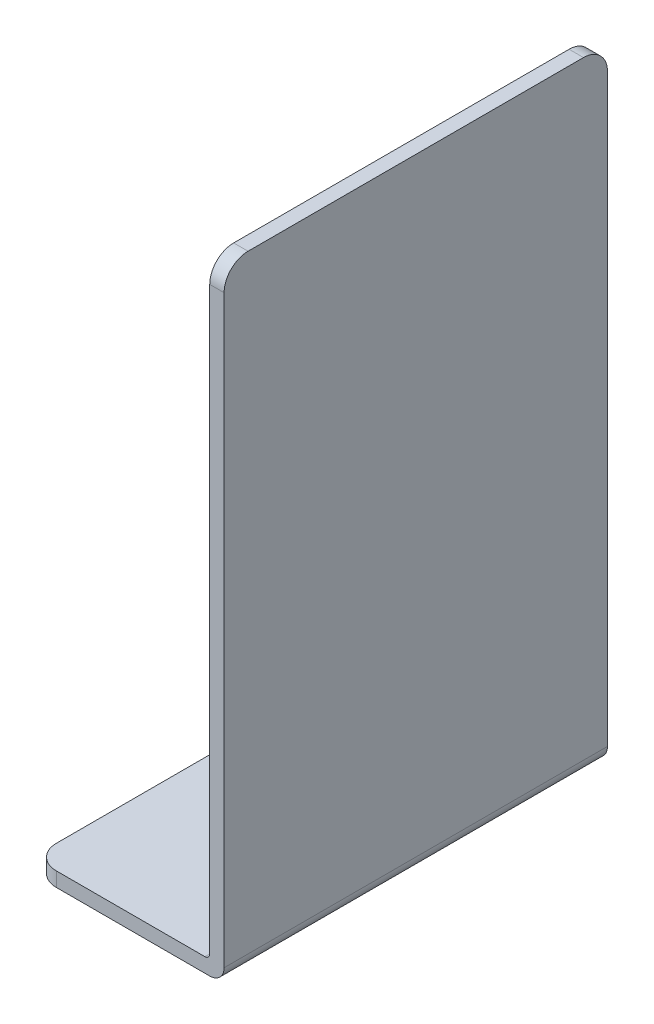
ISO-10303-21;
HEADER;
FILE_DESCRIPTION(('STEP AP214'),'2;1');
FILE_NAME('part.step','',(''),(''),'','','');
FILE_SCHEMA(('AUTOMOTIVE_DESIGN { 1 0 10303 214 1 1 1 1 }'));
ENDSEC;
DATA;
#1=APPLICATION_CONTEXT('core data for automotive mechanical design processes');
#2=APPLICATION_PROTOCOL_DEFINITION('international standard','automotive_design',2000,#1);
#3=PRODUCT_CONTEXT('',#1,'mechanical');
#4=PRODUCT('Part','Part','',(#3));
#5=PRODUCT_RELATED_PRODUCT_CATEGORY('part','',(#4));
#6=PRODUCT_DEFINITION_FORMATION('','',#4);
#7=PRODUCT_DEFINITION_CONTEXT('part definition',#1,'design');
#8=PRODUCT_DEFINITION('design','',#6,#7);
#9=PRODUCT_DEFINITION_SHAPE('','',#8);
#10=(LENGTH_UNIT() NAMED_UNIT(*) SI_UNIT(.MILLI.,.METRE.));
#11=(NAMED_UNIT(*) PLANE_ANGLE_UNIT() SI_UNIT($,.RADIAN.));
#12=(NAMED_UNIT(*) SI_UNIT($,.STERADIAN.) SOLID_ANGLE_UNIT());
#13=UNCERTAINTY_MEASURE_WITH_UNIT(LENGTH_MEASURE(1.E-05),#10,'distance_accuracy_value','');
#14=(GEOMETRIC_REPRESENTATION_CONTEXT(3) GLOBAL_UNCERTAINTY_ASSIGNED_CONTEXT((#13)) GLOBAL_UNIT_ASSIGNED_CONTEXT((#10,
#11,#12)) REPRESENTATION_CONTEXT('',''));
#15=CARTESIAN_POINT('',(0.,0.,0.));
#16=DIRECTION('',(0.,0.,1.));
#17=DIRECTION('',(1.,0.,0.));
#18=AXIS2_PLACEMENT_3D('',#15,#16,#17);
#19=CARTESIAN_POINT('',(-6.,0.,160.));
#20=DIRECTION('',(0.,-1.,0.));
#21=DIRECTION('',(0.,0.,-1.));
#22=AXIS2_PLACEMENT_3D('',#19,#20,#21);
#23=PLANE('',#22);
#24=DIRECTION('',(0.,0.,-1.));
#25=VECTOR('',#24,1.);
#26=CARTESIAN_POINT('',(0.,0.,160.));
#27=LINE('',#26,#25);
#28=CARTESIAN_POINT('',(0.,0.,150.));
#29=VERTEX_POINT('',#28);
#30=CARTESIAN_POINT('',(0.,0.,10.));
#31=VERTEX_POINT('',#30);
#32=EDGE_CURVE('E179',#29,#31,#27,.T.);
#33=ORIENTED_EDGE('',*,*,#32,.T.);
#34=DIRECTION('',(-1.,0.,0.));
#35=VECTOR('',#34,1.);
#36=CARTESIAN_POINT('',(-6.,0.,10.));
#37=LINE('',#36,#35);
#38=CARTESIAN_POINT('',(-6.,0.,10.));
#39=VERTEX_POINT('',#38);
#40=EDGE_CURVE('E252',#31,#39,#37,.T.);
#41=ORIENTED_EDGE('',*,*,#40,.T.);
#42=DIRECTION('',(0.,0.,-1.));
#43=VECTOR('',#42,1.);
#44=CARTESIAN_POINT('',(-6.,0.,160.));
#45=LINE('',#44,#43);
#46=CARTESIAN_POINT('',(-6.,0.,150.));
#47=VERTEX_POINT('',#46);
#48=EDGE_CURVE('E158',#47,#39,#45,.T.);
#49=ORIENTED_EDGE('',*,*,#48,.F.);
#50=DIRECTION('',(-1.,0.,0.));
#51=VECTOR('',#50,1.);
#52=CARTESIAN_POINT('',(-6.,0.,150.));
#53=LINE('',#52,#51);
#54=EDGE_CURVE('E66',#47,#29,#53,.F.);
#55=ORIENTED_EDGE('',*,*,#54,.T.);
#56=EDGE_LOOP('',(#33,#41,#49,#55));
#57=FACE_BOUND('',#56,.T.);
#58=ADVANCED_FACE('F45',(#57),#23,.F.);
#59=CARTESIAN_POINT('',(-5.99999999999997,-252.,160.));
#60=DIRECTION('',(1.,0.,0.));
#61=DIRECTION('',(0.,1.,0.));
#62=AXIS2_PLACEMENT_3D('',#59,#60,#61);
#63=PLANE('',#62);
#64=ORIENTED_EDGE('',*,*,#48,.T.);
#65=CARTESIAN_POINT('',(-6.,-10.,10.));
#66=DIRECTION('',(1.,0.,0.));
#67=DIRECTION('',(0.,1.,0.));
#68=AXIS2_PLACEMENT_3D('',#65,#66,#67);
#69=CIRCLE('',#68,10.);
#70=CARTESIAN_POINT('',(-6.,-10.,0.));
#71=VERTEX_POINT('',#70);
#72=EDGE_CURVE('E259',#39,#71,#69,.F.);
#73=ORIENTED_EDGE('',*,*,#72,.T.);
#74=DIRECTION('',(0.,-1.,0.));
#75=VECTOR('',#74,1.);
#76=CARTESIAN_POINT('',(-5.99999999999997,-252.,0.));
#77=LINE('',#76,#75);
#78=CARTESIAN_POINT('',(-5.99999999999998,-252.,0.));
#79=VERTEX_POINT('',#78);
#80=EDGE_CURVE('E154',#71,#79,#77,.T.);
#81=ORIENTED_EDGE('',*,*,#80,.T.);
#82=DIRECTION('',(0.,0.,-1.));
#83=VECTOR('',#82,1.);
#84=CARTESIAN_POINT('',(-5.99999999999998,-252.,160.));
#85=LINE('',#84,#83);
#86=CARTESIAN_POINT('',(-5.99999999999998,-252.,160.));
#87=VERTEX_POINT('',#86);
#88=EDGE_CURVE('E150',#87,#79,#85,.T.);
#89=ORIENTED_EDGE('',*,*,#88,.F.);
#90=DIRECTION('',(0.,-1.,0.));
#91=VECTOR('',#90,1.);
#92=CARTESIAN_POINT('',(-5.99999999999997,-252.,160.));
#93=LINE('',#92,#91);
#94=CARTESIAN_POINT('',(-6.,-10.,160.));
#95=VERTEX_POINT('',#94);
#96=EDGE_CURVE('E135',#95,#87,#93,.T.);
#97=ORIENTED_EDGE('',*,*,#96,.F.);
#98=CARTESIAN_POINT('',(-6.,-10.,150.));
#99=DIRECTION('',(1.,0.,0.));
#100=DIRECTION('',(0.,1.,0.));
#101=AXIS2_PLACEMENT_3D('',#98,#99,#100);
#102=CIRCLE('',#101,10.);
#103=EDGE_CURVE('E256',#95,#47,#102,.F.);
#104=ORIENTED_EDGE('',*,*,#103,.T.);
#105=EDGE_LOOP('',(#64,#73,#81,#89,#97,#104));
#106=FACE_BOUND('',#105,.T.);
#107=ADVANCED_FACE('F152',(#106),#63,.F.);
#108=CARTESIAN_POINT('',(-7.99999999999998,-252.,160.));
#109=DIRECTION('',(0.,0.,-1.));
#110=DIRECTION('',(-1.,0.,0.));
#111=AXIS2_PLACEMENT_3D('',#108,#109,#110);
#112=CYLINDRICAL_SURFACE('',#111,2.);
#113=CARTESIAN_POINT('',(-7.99999999999998,-252.,0.));
#114=DIRECTION('',(0.,0.,-1.));
#115=DIRECTION('',(1.,0.,0.));
#116=AXIS2_PLACEMENT_3D('',#113,#114,#115);
#117=CIRCLE('',#116,2.);
#118=CARTESIAN_POINT('',(-7.99999999999998,-254.,0.));
#119=VERTEX_POINT('',#118);
#120=EDGE_CURVE('E182',#79,#119,#117,.T.);
#121=ORIENTED_EDGE('',*,*,#120,.T.);
#122=DIRECTION('',(0.,0.,-1.));
#123=VECTOR('',#122,1.);
#124=CARTESIAN_POINT('',(-7.99999999999998,-254.,160.));
#125=LINE('',#124,#123);
#126=CARTESIAN_POINT('',(-7.99999999999998,-254.,160.));
#127=VERTEX_POINT('',#126);
#128=EDGE_CURVE('E159',#127,#119,#125,.T.);
#129=ORIENTED_EDGE('',*,*,#128,.F.);
#130=CARTESIAN_POINT('',(-7.99999999999998,-252.,160.));
#131=DIRECTION('',(0.,0.,-1.));
#132=DIRECTION('',(1.,0.,0.));
#133=AXIS2_PLACEMENT_3D('',#130,#131,#132);
#134=CIRCLE('',#133,2.);
#135=EDGE_CURVE('E140',#87,#127,#134,.T.);
#136=ORIENTED_EDGE('',*,*,#135,.F.);
#137=ORIENTED_EDGE('',*,*,#88,.T.);
#138=EDGE_LOOP('',(#121,#129,#136,#137));
#139=FACE_BOUND('',#138,.T.);
#140=ADVANCED_FACE('F161',(#139),#112,.F.);
#141=CARTESIAN_POINT('',(-80.,-254.,160.));
#142=DIRECTION('',(0.,-1.,0.));
#143=DIRECTION('',(0.,0.,-1.));
#144=AXIS2_PLACEMENT_3D('',#141,#142,#143);
#145=PLANE('',#144);
#146=DIRECTION('',(0.,0.,-1.));
#147=VECTOR('',#146,1.);
#148=CARTESIAN_POINT('',(-80.,-254.,160.));
#149=LINE('',#148,#147);
#150=CARTESIAN_POINT('',(-80.,-254.,150.));
#151=VERTEX_POINT('',#150);
#152=CARTESIAN_POINT('',(-80.,-254.,10.));
#153=VERTEX_POINT('',#152);
#154=EDGE_CURVE('E211',#151,#153,#149,.T.);
#155=ORIENTED_EDGE('',*,*,#154,.F.);
#156=CARTESIAN_POINT('',(-70.,-254.,150.));
#157=DIRECTION('',(0.,-1.,0.));
#158=DIRECTION('',(0.,0.,-1.));
#159=AXIS2_PLACEMENT_3D('',#156,#157,#158);
#160=CIRCLE('',#159,10.);
#161=CARTESIAN_POINT('',(-70.,-254.,160.));
#162=VERTEX_POINT('',#161);
#163=EDGE_CURVE('E241',#151,#162,#160,.F.);
#164=ORIENTED_EDGE('',*,*,#163,.T.);
#165=DIRECTION('',(-1.,0.,0.));
#166=VECTOR('',#165,1.);
#167=CARTESIAN_POINT('',(-80.,-254.,160.));
#168=LINE('',#167,#166);
#169=EDGE_CURVE('E165',#127,#162,#168,.T.);
#170=ORIENTED_EDGE('',*,*,#169,.F.);
#171=ORIENTED_EDGE('',*,*,#128,.T.);
#172=DIRECTION('',(-1.,0.,0.));
#173=VECTOR('',#172,1.);
#174=CARTESIAN_POINT('',(-80.,-254.,0.));
#175=LINE('',#174,#173);
#176=CARTESIAN_POINT('',(-70.,-254.,0.));
#177=VERTEX_POINT('',#176);
#178=EDGE_CURVE('E185',#119,#177,#175,.T.);
#179=ORIENTED_EDGE('',*,*,#178,.T.);
#180=CARTESIAN_POINT('',(-70.,-254.,10.));
#181=DIRECTION('',(0.,-1.,0.));
#182=DIRECTION('',(0.,0.,-1.));
#183=AXIS2_PLACEMENT_3D('',#180,#181,#182);
#184=CIRCLE('',#183,10.);
#185=EDGE_CURVE('E238',#177,#153,#184,.F.);
#186=ORIENTED_EDGE('',*,*,#185,.T.);
#187=EDGE_LOOP('',(#155,#164,#170,#171,#179,#186));
#188=FACE_BOUND('',#187,.T.);
#189=ADVANCED_FACE('F279',(#188),#145,.F.);
#190=CARTESIAN_POINT('',(-80.,-260.,160.));
#191=DIRECTION('',(1.,0.,0.));
#192=DIRECTION('',(0.,1.,0.));
#193=AXIS2_PLACEMENT_3D('',#190,#191,#192);
#194=PLANE('',#193);
#195=DIRECTION('',(0.,0.,-1.));
#196=VECTOR('',#195,1.);
#197=CARTESIAN_POINT('',(-80.,-260.,160.));
#198=LINE('',#197,#196);
#199=CARTESIAN_POINT('',(-80.,-260.,150.));
#200=VERTEX_POINT('',#199);
#201=CARTESIAN_POINT('',(-80.,-260.,10.));
#202=VERTEX_POINT('',#201);
#203=EDGE_CURVE('E207',#200,#202,#198,.T.);
#204=ORIENTED_EDGE('',*,*,#203,.F.);
#205=DIRECTION('',(0.,-1.,0.));
#206=VECTOR('',#205,1.);
#207=CARTESIAN_POINT('',(-80.,-260.,150.));
#208=LINE('',#207,#206);
#209=EDGE_CURVE('E235',#200,#151,#208,.F.);
#210=ORIENTED_EDGE('',*,*,#209,.T.);
#211=ORIENTED_EDGE('',*,*,#154,.T.);
#212=DIRECTION('',(0.,-1.,0.));
#213=VECTOR('',#212,1.);
#214=CARTESIAN_POINT('',(-80.,-260.,10.));
#215=LINE('',#214,#213);
#216=EDGE_CURVE('E231',#153,#202,#215,.T.);
#217=ORIENTED_EDGE('',*,*,#216,.T.);
#218=EDGE_LOOP('',(#204,#210,#211,#217));
#219=FACE_BOUND('',#218,.T.);
#220=ADVANCED_FACE('F292',(#219),#194,.F.);
#221=CARTESIAN_POINT('',(-5.99999999999997,-260.,160.));
#222=DIRECTION('',(0.,1.,0.));
#223=DIRECTION('',(0.,0.,1.));
#224=AXIS2_PLACEMENT_3D('',#221,#222,#223);
#225=PLANE('',#224);
#226=DIRECTION('',(1.,0.,0.));
#227=VECTOR('',#226,1.);
#228=CARTESIAN_POINT('',(-5.99999999999997,-260.,160.));
#229=LINE('',#228,#227);
#230=CARTESIAN_POINT('',(-70.,-260.,160.));
#231=VERTEX_POINT('',#230);
#232=CARTESIAN_POINT('',(-5.99999999999997,-260.,160.));
#233=VERTEX_POINT('',#232);
#234=EDGE_CURVE('E168',#231,#233,#229,.T.);
#235=ORIENTED_EDGE('',*,*,#234,.F.);
#236=CARTESIAN_POINT('',(-70.,-260.,150.));
#237=DIRECTION('',(0.,1.,0.));
#238=DIRECTION('',(0.,0.,1.));
#239=AXIS2_PLACEMENT_3D('',#236,#237,#238);
#240=CIRCLE('',#239,10.);
#241=EDGE_CURVE('E228',#231,#200,#240,.F.);
#242=ORIENTED_EDGE('',*,*,#241,.T.);
#243=ORIENTED_EDGE('',*,*,#203,.T.);
#244=CARTESIAN_POINT('',(-70.,-260.,10.));
#245=DIRECTION('',(0.,1.,0.));
#246=DIRECTION('',(0.,0.,1.));
#247=AXIS2_PLACEMENT_3D('',#244,#245,#246);
#248=CIRCLE('',#247,10.);
#249=CARTESIAN_POINT('',(-70.,-260.,0.));
#250=VERTEX_POINT('',#249);
#251=EDGE_CURVE('E225',#202,#250,#248,.F.);
#252=ORIENTED_EDGE('',*,*,#251,.T.);
#253=DIRECTION('',(1.,0.,0.));
#254=VECTOR('',#253,1.);
#255=CARTESIAN_POINT('',(-5.99999999999997,-260.,0.));
#256=LINE('',#255,#254);
#257=CARTESIAN_POINT('',(-5.99999999999997,-260.,0.));
#258=VERTEX_POINT('',#257);
#259=EDGE_CURVE('E189',#250,#258,#256,.T.);
#260=ORIENTED_EDGE('',*,*,#259,.T.);
#261=DIRECTION('',(0.,0.,-1.));
#262=VECTOR('',#261,1.);
#263=CARTESIAN_POINT('',(-5.99999999999997,-260.,160.));
#264=LINE('',#263,#262);
#265=EDGE_CURVE('E203',#233,#258,#264,.T.);
#266=ORIENTED_EDGE('',*,*,#265,.F.);
#267=EDGE_LOOP('',(#235,#242,#243,#252,#260,#266));
#268=FACE_BOUND('',#267,.T.);
#269=ADVANCED_FACE('F289',(#268),#225,.F.);
#270=CARTESIAN_POINT('',(-5.99999999999997,-254.,160.));
#271=DIRECTION('',(0.,0.,-1.));
#272=DIRECTION('',(-1.,0.,0.));
#273=AXIS2_PLACEMENT_3D('',#270,#271,#272);
#274=CYLINDRICAL_SURFACE('',#273,6.00000000000001);
#275=CARTESIAN_POINT('',(-5.99999999999997,-254.,0.));
#276=DIRECTION('',(0.,0.,1.));
#277=DIRECTION('',(-1.,0.,0.));
#278=AXIS2_PLACEMENT_3D('',#275,#276,#277);
#279=CIRCLE('',#278,6.00000000000001);
#280=CARTESIAN_POINT('',(0.,-254.,0.));
#281=VERTEX_POINT('',#280);
#282=EDGE_CURVE('E192',#258,#281,#279,.T.);
#283=ORIENTED_EDGE('',*,*,#282,.T.);
#284=DIRECTION('',(0.,0.,-1.));
#285=VECTOR('',#284,1.);
#286=CARTESIAN_POINT('',(0.,-254.,160.));
#287=LINE('',#286,#285);
#288=CARTESIAN_POINT('',(0.,-254.,160.));
#289=VERTEX_POINT('',#288);
#290=EDGE_CURVE('E199',#289,#281,#287,.T.);
#291=ORIENTED_EDGE('',*,*,#290,.F.);
#292=CARTESIAN_POINT('',(-5.99999999999997,-254.,160.));
#293=DIRECTION('',(0.,0.,1.));
#294=DIRECTION('',(-1.,0.,0.));
#295=AXIS2_PLACEMENT_3D('',#292,#293,#294);
#296=CIRCLE('',#295,6.00000000000001);
#297=EDGE_CURVE('E173',#233,#289,#296,.T.);
#298=ORIENTED_EDGE('',*,*,#297,.F.);
#299=ORIENTED_EDGE('',*,*,#265,.T.);
#300=EDGE_LOOP('',(#283,#291,#298,#299));
#301=FACE_BOUND('',#300,.T.);
#302=ADVANCED_FACE('F299',(#301),#274,.T.);
#303=CARTESIAN_POINT('',(0.,0.,160.));
#304=DIRECTION('',(-1.,0.,0.));
#305=DIRECTION('',(0.,-1.,0.));
#306=AXIS2_PLACEMENT_3D('',#303,#304,#305);
#307=PLANE('',#306);
#308=DIRECTION('',(0.,1.,0.));
#309=VECTOR('',#308,1.);
#310=CARTESIAN_POINT('',(0.,0.,0.));
#311=LINE('',#310,#309);
#312=CARTESIAN_POINT('',(0.,-10.,0.));
#313=VERTEX_POINT('',#312);
#314=EDGE_CURVE('E147',#281,#313,#311,.T.);
#315=ORIENTED_EDGE('',*,*,#314,.T.);
#316=CARTESIAN_POINT('',(0.,-10.,10.));
#317=DIRECTION('',(-1.,0.,0.));
#318=DIRECTION('',(0.,-1.,0.));
#319=AXIS2_PLACEMENT_3D('',#316,#317,#318);
#320=CIRCLE('',#319,10.);
#321=EDGE_CURVE('E11',#313,#31,#320,.F.);
#322=ORIENTED_EDGE('',*,*,#321,.T.);
#323=ORIENTED_EDGE('',*,*,#32,.F.);
#324=CARTESIAN_POINT('',(0.,-10.,150.));
#325=DIRECTION('',(-1.,0.,0.));
#326=DIRECTION('',(0.,-1.,0.));
#327=AXIS2_PLACEMENT_3D('',#324,#325,#326);
#328=CIRCLE('',#327,10.);
#329=CARTESIAN_POINT('',(0.,-10.,160.));
#330=VERTEX_POINT('',#329);
#331=EDGE_CURVE('E54',#29,#330,#328,.F.);
#332=ORIENTED_EDGE('',*,*,#331,.T.);
#333=DIRECTION('',(0.,1.,0.));
#334=VECTOR('',#333,1.);
#335=CARTESIAN_POINT('',(0.,0.,160.));
#336=LINE('',#335,#334);
#337=EDGE_CURVE('E176',#289,#330,#336,.T.);
#338=ORIENTED_EDGE('',*,*,#337,.F.);
#339=ORIENTED_EDGE('',*,*,#290,.T.);
#340=EDGE_LOOP('',(#315,#322,#323,#332,#338,#339));
#341=FACE_BOUND('',#340,.T.);
#342=ADVANCED_FACE('F264',(#341),#307,.F.);
#343=CARTESIAN_POINT('',(-5.99999999999997,-254.,160.));
#344=DIRECTION('',(0.,0.,-1.));
#345=DIRECTION('',(-1.,0.,0.));
#346=AXIS2_PLACEMENT_3D('',#343,#344,#345);
#347=PLANE('',#346);
#348=ORIENTED_EDGE('',*,*,#169,.T.);
#349=DIRECTION('',(0.,-1.,0.));
#350=VECTOR('',#349,1.);
#351=CARTESIAN_POINT('',(-70.,-254.,160.));
#352=LINE('',#351,#350);
#353=EDGE_CURVE('E221',#162,#231,#352,.T.);
#354=ORIENTED_EDGE('',*,*,#353,.T.);
#355=ORIENTED_EDGE('',*,*,#234,.T.);
#356=ORIENTED_EDGE('',*,*,#297,.T.);
#357=ORIENTED_EDGE('',*,*,#337,.T.);
#358=DIRECTION('',(-1.,0.,0.));
#359=VECTOR('',#358,1.);
#360=CARTESIAN_POINT('',(-5.99999999999997,-10.,160.));
#361=LINE('',#360,#359);
#362=EDGE_CURVE('E144',#330,#95,#361,.T.);
#363=ORIENTED_EDGE('',*,*,#362,.T.);
#364=ORIENTED_EDGE('',*,*,#96,.T.);
#365=ORIENTED_EDGE('',*,*,#135,.T.);
#366=EDGE_LOOP('',(#348,#354,#355,#356,#357,#363,#364,#365));
#367=FACE_BOUND('',#366,.T.);
#368=ADVANCED_FACE('F138',(#367),#347,.F.);
#369=CARTESIAN_POINT('',(-5.99999999999997,-254.,0.));
#370=DIRECTION('',(0.,0.,-1.));
#371=DIRECTION('',(-1.,0.,0.));
#372=AXIS2_PLACEMENT_3D('',#369,#370,#371);
#373=PLANE('',#372);
#374=ORIENTED_EDGE('',*,*,#259,.F.);
#375=DIRECTION('',(0.,-1.,0.));
#376=VECTOR('',#375,1.);
#377=CARTESIAN_POINT('',(-70.,-254.,0.));
#378=LINE('',#377,#376);
#379=EDGE_CURVE('E247',#250,#177,#378,.F.);
#380=ORIENTED_EDGE('',*,*,#379,.T.);
#381=ORIENTED_EDGE('',*,*,#178,.F.);
#382=ORIENTED_EDGE('',*,*,#120,.F.);
#383=ORIENTED_EDGE('',*,*,#80,.F.);
#384=DIRECTION('',(-1.,0.,0.));
#385=VECTOR('',#384,1.);
#386=CARTESIAN_POINT('',(0.,-10.,0.));
#387=LINE('',#386,#385);
#388=EDGE_CURVE('E244',#71,#313,#387,.F.);
#389=ORIENTED_EDGE('',*,*,#388,.T.);
#390=ORIENTED_EDGE('',*,*,#314,.F.);
#391=ORIENTED_EDGE('',*,*,#282,.F.);
#392=EDGE_LOOP('',(#374,#380,#381,#382,#383,#389,#390,#391));
#393=FACE_BOUND('',#392,.T.);
#394=ADVANCED_FACE('F274',(#393),#373,.T.);
#395=CARTESIAN_POINT('',(-70.,-254.,150.));
#396=DIRECTION('',(0.,-1.,0.));
#397=DIRECTION('',(1.,0.,0.));
#398=AXIS2_PLACEMENT_3D('',#395,#396,#397);
#399=CYLINDRICAL_SURFACE('',#398,10.);
#400=ORIENTED_EDGE('',*,*,#163,.F.);
#401=ORIENTED_EDGE('',*,*,#209,.F.);
#402=ORIENTED_EDGE('',*,*,#241,.F.);
#403=ORIENTED_EDGE('',*,*,#353,.F.);
#404=EDGE_LOOP('',(#400,#401,#402,#403));
#405=FACE_BOUND('',#404,.T.);
#406=ADVANCED_FACE('F285',(#405),#399,.T.);
#407=CARTESIAN_POINT('',(-70.,-260.,10.));
#408=DIRECTION('',(0.,1.,0.));
#409=DIRECTION('',(-1.,0.,0.));
#410=AXIS2_PLACEMENT_3D('',#407,#408,#409);
#411=CYLINDRICAL_SURFACE('',#410,10.);
#412=ORIENTED_EDGE('',*,*,#185,.F.);
#413=ORIENTED_EDGE('',*,*,#379,.F.);
#414=ORIENTED_EDGE('',*,*,#251,.F.);
#415=ORIENTED_EDGE('',*,*,#216,.F.);
#416=EDGE_LOOP('',(#412,#413,#414,#415));
#417=FACE_BOUND('',#416,.T.);
#418=ADVANCED_FACE('F295',(#417),#411,.T.);
#419=CARTESIAN_POINT('',(-6.,-10.,10.));
#420=DIRECTION('',(1.,0.,0.));
#421=DIRECTION('',(0.,0.,-1.));
#422=AXIS2_PLACEMENT_3D('',#419,#420,#421);
#423=CYLINDRICAL_SURFACE('',#422,10.);
#424=ORIENTED_EDGE('',*,*,#321,.F.);
#425=ORIENTED_EDGE('',*,*,#388,.F.);
#426=ORIENTED_EDGE('',*,*,#72,.F.);
#427=ORIENTED_EDGE('',*,*,#40,.F.);
#428=EDGE_LOOP('',(#424,#425,#426,#427));
#429=FACE_BOUND('',#428,.T.);
#430=ADVANCED_FACE('F270',(#429),#423,.T.);
#431=CARTESIAN_POINT('',(-5.99999999999997,-10.,150.));
#432=DIRECTION('',(-1.,0.,0.));
#433=DIRECTION('',(0.,0.,1.));
#434=AXIS2_PLACEMENT_3D('',#431,#432,#433);
#435=CYLINDRICAL_SURFACE('',#434,10.);
#436=ORIENTED_EDGE('',*,*,#331,.F.);
#437=ORIENTED_EDGE('',*,*,#54,.F.);
#438=ORIENTED_EDGE('',*,*,#103,.F.);
#439=ORIENTED_EDGE('',*,*,#362,.F.);
#440=EDGE_LOOP('',(#436,#437,#438,#439));
#441=FACE_BOUND('',#440,.T.);
#442=ADVANCED_FACE('F47',(#441),#435,.T.);
#443=CLOSED_SHELL('',(#58,#107,#140,#189,#220,#269,#302,#342,#368,#394,#406,#418,#430,#442));
#444=MANIFOLD_SOLID_BREP('B2',#443);
#445=ADVANCED_BREP_SHAPE_REPRESENTATION('',(#18,#444),#14);
#446=SHAPE_DEFINITION_REPRESENTATION(#9,#445);
ENDSEC;
END-ISO-10303-21;
